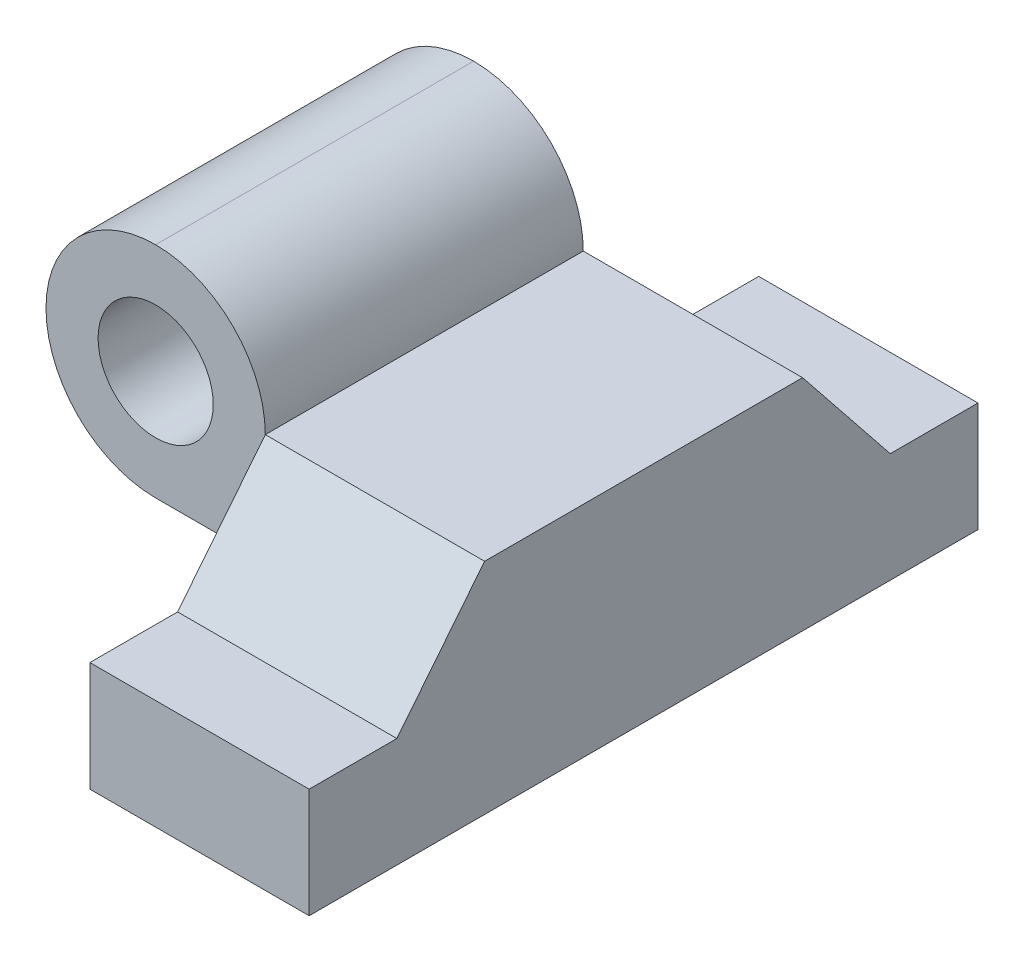
ISO-10303-21;
HEADER;
FILE_DESCRIPTION(('STEP AP214'),'2;1');
FILE_NAME('part.step','',(''),(''),'','','');
FILE_SCHEMA(('AUTOMOTIVE_DESIGN { 1 0 10303 214 1 1 1 1 }'));
ENDSEC;
DATA;
#1=APPLICATION_CONTEXT('core data for automotive mechanical design processes');
#2=APPLICATION_PROTOCOL_DEFINITION('international standard','automotive_design',2000,#1);
#3=PRODUCT_CONTEXT('',#1,'mechanical');
#4=PRODUCT('Part','Part','',(#3));
#5=PRODUCT_RELATED_PRODUCT_CATEGORY('part','',(#4));
#6=PRODUCT_DEFINITION_FORMATION('','',#4);
#7=PRODUCT_DEFINITION_CONTEXT('part definition',#1,'design');
#8=PRODUCT_DEFINITION('design','',#6,#7);
#9=PRODUCT_DEFINITION_SHAPE('','',#8);
#10=(LENGTH_UNIT() NAMED_UNIT(*) SI_UNIT(.MILLI.,.METRE.));
#11=(NAMED_UNIT(*) PLANE_ANGLE_UNIT() SI_UNIT($,.RADIAN.));
#12=(NAMED_UNIT(*) SI_UNIT($,.STERADIAN.) SOLID_ANGLE_UNIT());
#13=UNCERTAINTY_MEASURE_WITH_UNIT(LENGTH_MEASURE(1.E-05),#10,'distance_accuracy_value','');
#14=(GEOMETRIC_REPRESENTATION_CONTEXT(3) GLOBAL_UNCERTAINTY_ASSIGNED_CONTEXT((#13)) GLOBAL_UNIT_ASSIGNED_CONTEXT((#10,
#11,#12)) REPRESENTATION_CONTEXT('',''));
#15=CARTESIAN_POINT('',(0.,0.,0.));
#16=DIRECTION('',(0.,0.,1.));
#17=DIRECTION('',(1.,0.,0.));
#18=AXIS2_PLACEMENT_3D('',#15,#16,#17);
#19=CARTESIAN_POINT('',(-6.,9.,4.35));
#20=DIRECTION('',(0.,0.,-1.));
#21=DIRECTION('',(-1.,0.,0.));
#22=AXIS2_PLACEMENT_3D('',#19,#20,#21);
#23=PLANE('',#22);
#24=CARTESIAN_POINT('',(-3.,6.,4.35));
#25=DIRECTION('',(0.,0.,-1.));
#26=DIRECTION('',(-1.,0.,0.));
#27=AXIS2_PLACEMENT_3D('',#24,#25,#26);
#28=CIRCLE('',#27,1.575);
#29=CARTESIAN_POINT('',(-4.575,6.,4.35));
#30=VERTEX_POINT('',#29);
#31=EDGE_CURVE('E200',#30,#30,#28,.T.);
#32=ORIENTED_EDGE('',*,*,#31,.T.);
#33=EDGE_LOOP('',(#32));
#34=FACE_BOUND('',#33,.T.);
#35=DIRECTION('',(0.,-1.,0.));
#36=VECTOR('',#35,1.);
#37=CARTESIAN_POINT('',(0.,3.,4.35));
#38=LINE('',#37,#36);
#39=CARTESIAN_POINT('',(0.,6.,4.35));
#40=VERTEX_POINT('',#39);
#41=CARTESIAN_POINT('',(0.,3.,4.35));
#42=VERTEX_POINT('',#41);
#43=EDGE_CURVE('E162',#40,#42,#38,.T.);
#44=ORIENTED_EDGE('',*,*,#43,.F.);
#45=CARTESIAN_POINT('',(-3.,6.,4.35));
#46=DIRECTION('',(0.,0.,-1.));
#47=DIRECTION('',(-1.,0.,0.));
#48=AXIS2_PLACEMENT_3D('',#45,#46,#47);
#49=CIRCLE('',#48,3.);
#50=CARTESIAN_POINT('',(-3.,9.,4.35));
#51=VERTEX_POINT('',#50);
#52=EDGE_CURVE('E241',#40,#51,#49,.F.);
#53=ORIENTED_EDGE('',*,*,#52,.T.);
#54=CARTESIAN_POINT('',(-3.,6.,4.35));
#55=DIRECTION('',(0.,0.,-1.));
#56=DIRECTION('',(-1.,0.,0.));
#57=AXIS2_PLACEMENT_3D('',#54,#55,#56);
#58=CIRCLE('',#57,3.);
#59=CARTESIAN_POINT('',(-6.,6.,4.35));
#60=VERTEX_POINT('',#59);
#61=EDGE_CURVE('E247',#51,#60,#58,.F.);
#62=ORIENTED_EDGE('',*,*,#61,.T.);
#63=CARTESIAN_POINT('',(-3.,6.,4.35));
#64=DIRECTION('',(0.,0.,-1.));
#65=DIRECTION('',(-1.,0.,0.));
#66=AXIS2_PLACEMENT_3D('',#63,#64,#65);
#67=CIRCLE('',#66,3.);
#68=CARTESIAN_POINT('',(-3.,3.,4.35));
#69=VERTEX_POINT('',#68);
#70=EDGE_CURVE('E11',#60,#69,#67,.F.);
#71=ORIENTED_EDGE('',*,*,#70,.T.);
#72=DIRECTION('',(1.,0.,0.));
#73=VECTOR('',#72,1.);
#74=CARTESIAN_POINT('',(-6.,3.,4.35));
#75=LINE('',#74,#73);
#76=EDGE_CURVE('E204',#69,#42,#75,.T.);
#77=ORIENTED_EDGE('',*,*,#76,.T.);
#78=EDGE_LOOP('',(#44,#53,#62,#71,#77));
#79=FACE_BOUND('',#78,.T.);
#80=ADVANCED_FACE('F47',(#34,#79),#23,.F.);
#81=CARTESIAN_POINT('',(-6.,9.,-4.35));
#82=DIRECTION('',(0.,0.,1.));
#83=DIRECTION('',(1.,0.,0.));
#84=AXIS2_PLACEMENT_3D('',#81,#82,#83);
#85=PLANE('',#84);
#86=CARTESIAN_POINT('',(-3.,6.,-4.35));
#87=DIRECTION('',(0.,0.,1.));
#88=DIRECTION('',(1.,0.,0.));
#89=AXIS2_PLACEMENT_3D('',#86,#87,#88);
#90=CIRCLE('',#89,1.575);
#91=CARTESIAN_POINT('',(-1.425,6.,-4.35));
#92=VERTEX_POINT('',#91);
#93=EDGE_CURVE('E205',#92,#92,#90,.T.);
#94=ORIENTED_EDGE('',*,*,#93,.T.);
#95=EDGE_LOOP('',(#94));
#96=FACE_BOUND('',#95,.T.);
#97=DIRECTION('',(0.,1.,0.));
#98=VECTOR('',#97,1.);
#99=CARTESIAN_POINT('',(0.,6.,-4.35));
#100=LINE('',#99,#98);
#101=CARTESIAN_POINT('',(0.,3.,-4.35));
#102=VERTEX_POINT('',#101);
#103=CARTESIAN_POINT('',(0.,6.,-4.35));
#104=VERTEX_POINT('',#103);
#105=EDGE_CURVE('E172',#102,#104,#100,.T.);
#106=ORIENTED_EDGE('',*,*,#105,.F.);
#107=DIRECTION('',(-1.,0.,0.));
#108=VECTOR('',#107,1.);
#109=CARTESIAN_POINT('',(-6.,3.,-4.35));
#110=LINE('',#109,#108);
#111=CARTESIAN_POINT('',(-3.,3.,-4.35));
#112=VERTEX_POINT('',#111);
#113=EDGE_CURVE('E208',#102,#112,#110,.T.);
#114=ORIENTED_EDGE('',*,*,#113,.T.);
#115=CARTESIAN_POINT('',(-3.,6.,-4.35));
#116=DIRECTION('',(0.,0.,1.));
#117=DIRECTION('',(1.,0.,0.));
#118=AXIS2_PLACEMENT_3D('',#115,#116,#117);
#119=CIRCLE('',#118,3.);
#120=CARTESIAN_POINT('',(-6.,6.,-4.35));
#121=VERTEX_POINT('',#120);
#122=EDGE_CURVE('E56',#112,#121,#119,.F.);
#123=ORIENTED_EDGE('',*,*,#122,.T.);
#124=CARTESIAN_POINT('',(-3.,6.,-4.35));
#125=DIRECTION('',(0.,0.,1.));
#126=DIRECTION('',(1.,0.,0.));
#127=AXIS2_PLACEMENT_3D('',#124,#125,#126);
#128=CIRCLE('',#127,3.);
#129=CARTESIAN_POINT('',(-3.,9.,-4.35));
#130=VERTEX_POINT('',#129);
#131=EDGE_CURVE('E257',#121,#130,#128,.F.);
#132=ORIENTED_EDGE('',*,*,#131,.T.);
#133=CARTESIAN_POINT('',(-3.,6.,-4.35));
#134=DIRECTION('',(0.,0.,1.));
#135=DIRECTION('',(1.,0.,0.));
#136=AXIS2_PLACEMENT_3D('',#133,#134,#135);
#137=CIRCLE('',#136,3.);
#138=EDGE_CURVE('E254',#130,#104,#137,.F.);
#139=ORIENTED_EDGE('',*,*,#138,.T.);
#140=EDGE_LOOP('',(#106,#114,#123,#132,#139));
#141=FACE_BOUND('',#140,.T.);
#142=ADVANCED_FACE('F274',(#96,#141),#85,.F.);
#143=CARTESIAN_POINT('',(0.,3.,0.));
#144=DIRECTION('',(0.,-1.,0.));
#145=DIRECTION('',(0.,0.,-1.));
#146=AXIS2_PLACEMENT_3D('',#143,#144,#145);
#147=PLANE('',#146);
#148=DIRECTION('',(0.,0.,-1.));
#149=VECTOR('',#148,1.);
#150=CARTESIAN_POINT('',(6.,3.,9.15));
#151=LINE('',#150,#149);
#152=CARTESIAN_POINT('',(6.,3.,9.15));
#153=VERTEX_POINT('',#152);
#154=CARTESIAN_POINT('',(6.,3.,6.75));
#155=VERTEX_POINT('',#154);
#156=EDGE_CURVE('E63',#153,#155,#151,.T.);
#157=ORIENTED_EDGE('',*,*,#156,.T.);
#158=DIRECTION('',(1.,0.,0.));
#159=VECTOR('',#158,1.);
#160=CARTESIAN_POINT('',(-3.84187454245971,3.,6.75));
#161=LINE('',#160,#159);
#162=CARTESIAN_POINT('',(0.,3.,6.75));
#163=VERTEX_POINT('',#162);
#164=EDGE_CURVE('E151',#163,#155,#161,.T.);
#165=ORIENTED_EDGE('',*,*,#164,.F.);
#166=DIRECTION('',(0.,0.,1.));
#167=VECTOR('',#166,1.);
#168=CARTESIAN_POINT('',(0.,3.,9.15));
#169=LINE('',#168,#167);
#170=CARTESIAN_POINT('',(0.,3.,9.15));
#171=VERTEX_POINT('',#170);
#172=EDGE_CURVE('E137',#163,#171,#169,.T.);
#173=ORIENTED_EDGE('',*,*,#172,.T.);
#174=DIRECTION('',(1.,0.,0.));
#175=VECTOR('',#174,1.);
#176=CARTESIAN_POINT('',(-6.,3.,9.15));
#177=LINE('',#176,#175);
#178=EDGE_CURVE('E220',#171,#153,#177,.T.);
#179=ORIENTED_EDGE('',*,*,#178,.T.);
#180=EDGE_LOOP('',(#157,#165,#173,#179));
#181=FACE_BOUND('',#180,.T.);
#182=ADVANCED_FACE('F152',(#181),#147,.F.);
#183=CARTESIAN_POINT('',(0.,3.,-9.15));
#184=VERTEX_POINT('',#183);
#185=CARTESIAN_POINT('',(0.,3.,-6.75));
#186=VERTEX_POINT('',#185);
#187=EDGE_CURVE('E150',#184,#186,#169,.T.);
#188=ORIENTED_EDGE('',*,*,#187,.T.);
#189=DIRECTION('',(1.,0.,0.));
#190=VECTOR('',#189,1.);
#191=CARTESIAN_POINT('',(-3.84187454245971,3.,-6.75));
#192=LINE('',#191,#190);
#193=CARTESIAN_POINT('',(6.,3.,-6.75));
#194=VERTEX_POINT('',#193);
#195=EDGE_CURVE('E71',#186,#194,#192,.T.);
#196=ORIENTED_EDGE('',*,*,#195,.T.);
#197=CARTESIAN_POINT('',(6.,3.,-9.15));
#198=VERTEX_POINT('',#197);
#199=EDGE_CURVE('E216',#194,#198,#151,.T.);
#200=ORIENTED_EDGE('',*,*,#199,.T.);
#201=DIRECTION('',(-1.,0.,0.));
#202=VECTOR('',#201,1.);
#203=CARTESIAN_POINT('',(-6.,3.,-9.15));
#204=LINE('',#203,#202);
#205=EDGE_CURVE('E215',#198,#184,#204,.T.);
#206=ORIENTED_EDGE('',*,*,#205,.T.);
#207=EDGE_LOOP('',(#188,#196,#200,#206));
#208=FACE_BOUND('',#207,.T.);
#209=ADVANCED_FACE('F337',(#208),#147,.F.);
#210=CARTESIAN_POINT('',(6.,3.,9.15));
#211=DIRECTION('',(-1.,0.,0.));
#212=DIRECTION('',(0.,0.,1.));
#213=AXIS2_PLACEMENT_3D('',#210,#211,#212);
#214=PLANE('',#213);
#215=ORIENTED_EDGE('',*,*,#199,.F.);
#216=DIRECTION('',(0.,0.78086880944303,0.624695047554425));
#217=VECTOR('',#216,1.);
#218=CARTESIAN_POINT('',(6.,3.,-6.75));
#219=LINE('',#218,#217);
#220=CARTESIAN_POINT('',(6.,6.,-4.35));
#221=VERTEX_POINT('',#220);
#222=EDGE_CURVE('E176',#194,#221,#219,.T.);
#223=ORIENTED_EDGE('',*,*,#222,.T.);
#224=DIRECTION('',(0.,0.,-1.));
#225=VECTOR('',#224,1.);
#226=CARTESIAN_POINT('',(6.,6.,4.35));
#227=LINE('',#226,#225);
#228=CARTESIAN_POINT('',(6.,6.,4.35));
#229=VERTEX_POINT('',#228);
#230=EDGE_CURVE('E192',#229,#221,#227,.T.);
#231=ORIENTED_EDGE('',*,*,#230,.F.);
#232=DIRECTION('',(0.,-0.78086880944303,0.624695047554425));
#233=VECTOR('',#232,1.);
#234=CARTESIAN_POINT('',(6.,6.,4.35));
#235=LINE('',#234,#233);
#236=EDGE_CURVE('E157',#229,#155,#235,.T.);
#237=ORIENTED_EDGE('',*,*,#236,.T.);
#238=ORIENTED_EDGE('',*,*,#156,.F.);
#239=DIRECTION('',(0.,-1.,0.));
#240=VECTOR('',#239,1.);
#241=CARTESIAN_POINT('',(6.,3.,9.15));
#242=LINE('',#241,#240);
#243=CARTESIAN_POINT('',(6.,0.,9.15));
#244=VERTEX_POINT('',#243);
#245=EDGE_CURVE('E223',#153,#244,#242,.T.);
#246=ORIENTED_EDGE('',*,*,#245,.T.);
#247=DIRECTION('',(0.,0.,-1.));
#248=VECTOR('',#247,1.);
#249=CARTESIAN_POINT('',(6.,0.,9.15));
#250=LINE('',#249,#248);
#251=CARTESIAN_POINT('',(6.,0.,-9.15));
#252=VERTEX_POINT('',#251);
#253=EDGE_CURVE('E212',#244,#252,#250,.T.);
#254=ORIENTED_EDGE('',*,*,#253,.T.);
#255=DIRECTION('',(0.,-1.,0.));
#256=VECTOR('',#255,1.);
#257=CARTESIAN_POINT('',(6.,3.,-9.15));
#258=LINE('',#257,#256);
#259=EDGE_CURVE('E237',#198,#252,#258,.T.);
#260=ORIENTED_EDGE('',*,*,#259,.F.);
#261=EDGE_LOOP('',(#215,#223,#231,#237,#238,#246,#254,#260));
#262=FACE_BOUND('',#261,.T.);
#263=ADVANCED_FACE('F304',(#262),#214,.F.);
#264=CARTESIAN_POINT('',(-6.,3.,-9.15));
#265=DIRECTION('',(0.,0.,1.));
#266=DIRECTION('',(1.,0.,0.));
#267=AXIS2_PLACEMENT_3D('',#264,#265,#266);
#268=PLANE('',#267);
#269=DIRECTION('',(-1.,0.,0.));
#270=VECTOR('',#269,1.);
#271=CARTESIAN_POINT('',(-6.,0.,-9.15));
#272=LINE('',#271,#270);
#273=CARTESIAN_POINT('',(0.,0.,-9.15));
#274=VERTEX_POINT('',#273);
#275=EDGE_CURVE('E227',#252,#274,#272,.T.);
#276=ORIENTED_EDGE('',*,*,#275,.T.);
#277=DIRECTION('',(0.,-1.,0.));
#278=VECTOR('',#277,1.);
#279=CARTESIAN_POINT('',(0.,3.,-9.15));
#280=LINE('',#279,#278);
#281=EDGE_CURVE('E183',#184,#274,#280,.T.);
#282=ORIENTED_EDGE('',*,*,#281,.F.);
#283=ORIENTED_EDGE('',*,*,#205,.F.);
#284=ORIENTED_EDGE('',*,*,#259,.T.);
#285=EDGE_LOOP('',(#276,#282,#283,#284));
#286=FACE_BOUND('',#285,.T.);
#287=ADVANCED_FACE('F336',(#286),#268,.F.);
#288=CARTESIAN_POINT('',(-6.,3.,9.15));
#289=DIRECTION('',(0.,0.,-1.));
#290=DIRECTION('',(-1.,0.,0.));
#291=AXIS2_PLACEMENT_3D('',#288,#289,#290);
#292=PLANE('',#291);
#293=ORIENTED_EDGE('',*,*,#178,.F.);
#294=DIRECTION('',(0.,-1.,0.));
#295=VECTOR('',#294,1.);
#296=CARTESIAN_POINT('',(0.,3.,9.15));
#297=LINE('',#296,#295);
#298=CARTESIAN_POINT('',(0.,0.,9.15));
#299=VERTEX_POINT('',#298);
#300=EDGE_CURVE('E144',#171,#299,#297,.T.);
#301=ORIENTED_EDGE('',*,*,#300,.T.);
#302=DIRECTION('',(1.,0.,0.));
#303=VECTOR('',#302,1.);
#304=CARTESIAN_POINT('',(-6.,0.,9.15));
#305=LINE('',#304,#303);
#306=EDGE_CURVE('E231',#299,#244,#305,.T.);
#307=ORIENTED_EDGE('',*,*,#306,.T.);
#308=ORIENTED_EDGE('',*,*,#245,.F.);
#309=EDGE_LOOP('',(#293,#301,#307,#308));
#310=FACE_BOUND('',#309,.T.);
#311=ADVANCED_FACE('F338',(#310),#292,.F.);
#312=CARTESIAN_POINT('',(0.,0.,0.));
#313=DIRECTION('',(0.,-1.,0.));
#314=DIRECTION('',(0.,0.,-1.));
#315=AXIS2_PLACEMENT_3D('',#312,#313,#314);
#316=PLANE('',#315);
#317=DIRECTION('',(0.,0.,1.));
#318=VECTOR('',#317,1.);
#319=CARTESIAN_POINT('',(0.,0.,9.15));
#320=LINE('',#319,#318);
#321=EDGE_CURVE('E148',#274,#299,#320,.T.);
#322=ORIENTED_EDGE('',*,*,#321,.F.);
#323=ORIENTED_EDGE('',*,*,#275,.F.);
#324=ORIENTED_EDGE('',*,*,#253,.F.);
#325=ORIENTED_EDGE('',*,*,#306,.F.);
#326=EDGE_LOOP('',(#322,#323,#324,#325));
#327=FACE_BOUND('',#326,.T.);
#328=ADVANCED_FACE('F333',(#327),#316,.T.);
#329=CARTESIAN_POINT('',(-3.,6.,-9.15));
#330=DIRECTION('',(0.,0.,1.));
#331=DIRECTION('',(1.,0.,0.));
#332=AXIS2_PLACEMENT_3D('',#329,#330,#331);
#333=CYLINDRICAL_SURFACE('',#332,1.575);
#334=ORIENTED_EDGE('',*,*,#93,.F.);
#335=EDGE_LOOP('',(#334));
#336=FACE_BOUND('',#335,.T.);
#337=ORIENTED_EDGE('',*,*,#31,.F.);
#338=EDGE_LOOP('',(#337));
#339=FACE_BOUND('',#338,.T.);
#340=ADVANCED_FACE('F345',(#336,#339),#333,.F.);
#341=CARTESIAN_POINT('',(-3.,6.,0.));
#342=DIRECTION('',(0.,0.,1.));
#343=DIRECTION('',(1.,0.,0.));
#344=AXIS2_PLACEMENT_3D('',#341,#342,#343);
#345=CYLINDRICAL_SURFACE('',#344,3.);
#346=DIRECTION('',(0.,0.,-1.));
#347=VECTOR('',#346,1.);
#348=CARTESIAN_POINT('',(0.,6.,4.35));
#349=LINE('',#348,#347);
#350=EDGE_CURVE('E260',#104,#40,#349,.F.);
#351=ORIENTED_EDGE('',*,*,#350,.F.);
#352=ORIENTED_EDGE('',*,*,#138,.F.);
#353=DIRECTION('',(0.,0.,-1.));
#354=VECTOR('',#353,1.);
#355=CARTESIAN_POINT('',(-3.,9.,-4.35));
#356=LINE('',#355,#354);
#357=EDGE_CURVE('E199',#51,#130,#356,.T.);
#358=ORIENTED_EDGE('',*,*,#357,.F.);
#359=ORIENTED_EDGE('',*,*,#52,.F.);
#360=EDGE_LOOP('',(#351,#352,#358,#359));
#361=FACE_BOUND('',#360,.T.);
#362=ADVANCED_FACE('F294',(#361),#345,.T.);
#363=CARTESIAN_POINT('',(-3.,6.,0.));
#364=DIRECTION('',(0.,0.,-1.));
#365=DIRECTION('',(-1.,0.,0.));
#366=AXIS2_PLACEMENT_3D('',#363,#364,#365);
#367=CYLINDRICAL_SURFACE('',#366,3.);
#368=ORIENTED_EDGE('',*,*,#131,.F.);
#369=DIRECTION('',(0.,0.,1.));
#370=VECTOR('',#369,1.);
#371=CARTESIAN_POINT('',(-6.,6.,-4.35));
#372=LINE('',#371,#370);
#373=EDGE_CURVE('E250',#60,#121,#372,.F.);
#374=ORIENTED_EDGE('',*,*,#373,.F.);
#375=ORIENTED_EDGE('',*,*,#61,.F.);
#376=ORIENTED_EDGE('',*,*,#357,.T.);
#377=EDGE_LOOP('',(#368,#374,#375,#376));
#378=FACE_BOUND('',#377,.T.);
#379=ADVANCED_FACE('F281',(#378),#367,.T.);
#380=CARTESIAN_POINT('',(0.,6.,0.));
#381=DIRECTION('',(0.,-1.,0.));
#382=DIRECTION('',(0.,0.,-1.));
#383=AXIS2_PLACEMENT_3D('',#380,#381,#382);
#384=PLANE('',#383);
#385=ORIENTED_EDGE('',*,*,#350,.T.);
#386=DIRECTION('',(1.,0.,0.));
#387=VECTOR('',#386,1.);
#388=CARTESIAN_POINT('',(0.,6.,4.35));
#389=LINE('',#388,#387);
#390=EDGE_CURVE('E160',#40,#229,#389,.T.);
#391=ORIENTED_EDGE('',*,*,#390,.T.);
#392=ORIENTED_EDGE('',*,*,#230,.T.);
#393=DIRECTION('',(-1.,0.,0.));
#394=VECTOR('',#393,1.);
#395=CARTESIAN_POINT('',(0.,6.,-4.35));
#396=LINE('',#395,#394);
#397=EDGE_CURVE('E195',#221,#104,#396,.T.);
#398=ORIENTED_EDGE('',*,*,#397,.T.);
#399=EDGE_LOOP('',(#385,#391,#392,#398));
#400=FACE_BOUND('',#399,.T.);
#401=ADVANCED_FACE('F296',(#400),#384,.F.);
#402=CARTESIAN_POINT('',(0.,3.,0.));
#403=DIRECTION('',(0.,-1.,0.));
#404=DIRECTION('',(0.,0.,-1.));
#405=AXIS2_PLACEMENT_3D('',#402,#403,#404);
#406=PLANE('',#405);
#407=ORIENTED_EDGE('',*,*,#76,.F.);
#408=DIRECTION('',(0.,0.,-1.));
#409=VECTOR('',#408,1.);
#410=CARTESIAN_POINT('',(-3.,3.,-4.35));
#411=LINE('',#410,#409);
#412=EDGE_CURVE('E264',#69,#112,#411,.T.);
#413=ORIENTED_EDGE('',*,*,#412,.T.);
#414=ORIENTED_EDGE('',*,*,#113,.F.);
#415=EDGE_CURVE('E147',#102,#42,#169,.T.);
#416=ORIENTED_EDGE('',*,*,#415,.T.);
#417=EDGE_LOOP('',(#407,#413,#414,#416));
#418=FACE_BOUND('',#417,.T.);
#419=ADVANCED_FACE('F289',(#418),#406,.T.);
#420=CARTESIAN_POINT('',(0.,3.,9.15));
#421=DIRECTION('',(1.,0.,0.));
#422=DIRECTION('',(0.,0.,-1.));
#423=AXIS2_PLACEMENT_3D('',#420,#421,#422);
#424=PLANE('',#423);
#425=ORIENTED_EDGE('',*,*,#321,.T.);
#426=ORIENTED_EDGE('',*,*,#300,.F.);
#427=ORIENTED_EDGE('',*,*,#172,.F.);
#428=DIRECTION('',(0.,0.78086880944303,-0.624695047554424));
#429=VECTOR('',#428,1.);
#430=CARTESIAN_POINT('',(0.,6.,4.35));
#431=LINE('',#430,#429);
#432=EDGE_CURVE('E141',#163,#40,#431,.T.);
#433=ORIENTED_EDGE('',*,*,#432,.T.);
#434=ORIENTED_EDGE('',*,*,#43,.T.);
#435=ORIENTED_EDGE('',*,*,#415,.F.);
#436=ORIENTED_EDGE('',*,*,#105,.T.);
#437=DIRECTION('',(0.,-0.78086880944303,-0.624695047554424));
#438=VECTOR('',#437,1.);
#439=CARTESIAN_POINT('',(0.,3.,-6.75));
#440=LINE('',#439,#438);
#441=EDGE_CURVE('E168',#104,#186,#440,.T.);
#442=ORIENTED_EDGE('',*,*,#441,.T.);
#443=ORIENTED_EDGE('',*,*,#187,.F.);
#444=ORIENTED_EDGE('',*,*,#281,.T.);
#445=EDGE_LOOP('',(#425,#426,#427,#433,#434,#435,#436,#442,#443,#444));
#446=FACE_BOUND('',#445,.T.);
#447=ADVANCED_FACE('F138',(#446),#424,.F.);
#448=CARTESIAN_POINT('',(-3.,6.,0.));
#449=DIRECTION('',(0.,0.,1.));
#450=DIRECTION('',(1.,0.,0.));
#451=AXIS2_PLACEMENT_3D('',#448,#449,#450);
#452=CYLINDRICAL_SURFACE('',#451,3.);
#453=ORIENTED_EDGE('',*,*,#70,.F.);
#454=ORIENTED_EDGE('',*,*,#373,.T.);
#455=ORIENTED_EDGE('',*,*,#122,.F.);
#456=ORIENTED_EDGE('',*,*,#412,.F.);
#457=EDGE_LOOP('',(#453,#454,#455,#456));
#458=FACE_BOUND('',#457,.T.);
#459=ADVANCED_FACE('F49',(#458),#452,.T.);
#460=CARTESIAN_POINT('',(-3.84187454245971,3.,-6.75));
#461=DIRECTION('',(0.,0.624695047554424,-0.78086880944303));
#462=DIRECTION('',(0.,0.78086880944303,0.624695047554424));
#463=AXIS2_PLACEMENT_3D('',#460,#461,#462);
#464=PLANE('',#463);
#465=ORIENTED_EDGE('',*,*,#441,.F.);
#466=ORIENTED_EDGE('',*,*,#397,.F.);
#467=ORIENTED_EDGE('',*,*,#222,.F.);
#468=ORIENTED_EDGE('',*,*,#195,.F.);
#469=EDGE_LOOP('',(#465,#466,#467,#468));
#470=FACE_BOUND('',#469,.T.);
#471=ADVANCED_FACE('F302',(#470),#464,.T.);
#472=CARTESIAN_POINT('',(-3.84187454245971,6.,4.35));
#473=DIRECTION('',(0.,0.624695047554424,0.78086880944303));
#474=DIRECTION('',(0.,-0.78086880944303,0.624695047554424));
#475=AXIS2_PLACEMENT_3D('',#472,#473,#474);
#476=PLANE('',#475);
#477=ORIENTED_EDGE('',*,*,#432,.F.);
#478=ORIENTED_EDGE('',*,*,#164,.T.);
#479=ORIENTED_EDGE('',*,*,#236,.F.);
#480=ORIENTED_EDGE('',*,*,#390,.F.);
#481=EDGE_LOOP('',(#477,#478,#479,#480));
#482=FACE_BOUND('',#481,.T.);
#483=ADVANCED_FACE('F159',(#482),#476,.T.);
#484=CLOSED_SHELL('',(#80,#142,#182,#209,#263,#287,#311,#328,#340,#362,#379,#401,#419,#447,#459,
#471,#483));
#485=MANIFOLD_SOLID_BREP('B2',#484);
#486=ADVANCED_BREP_SHAPE_REPRESENTATION('',(#18,#485),#14);
#487=SHAPE_DEFINITION_REPRESENTATION(#9,#486);
ENDSEC;
END-ISO-10303-21;
